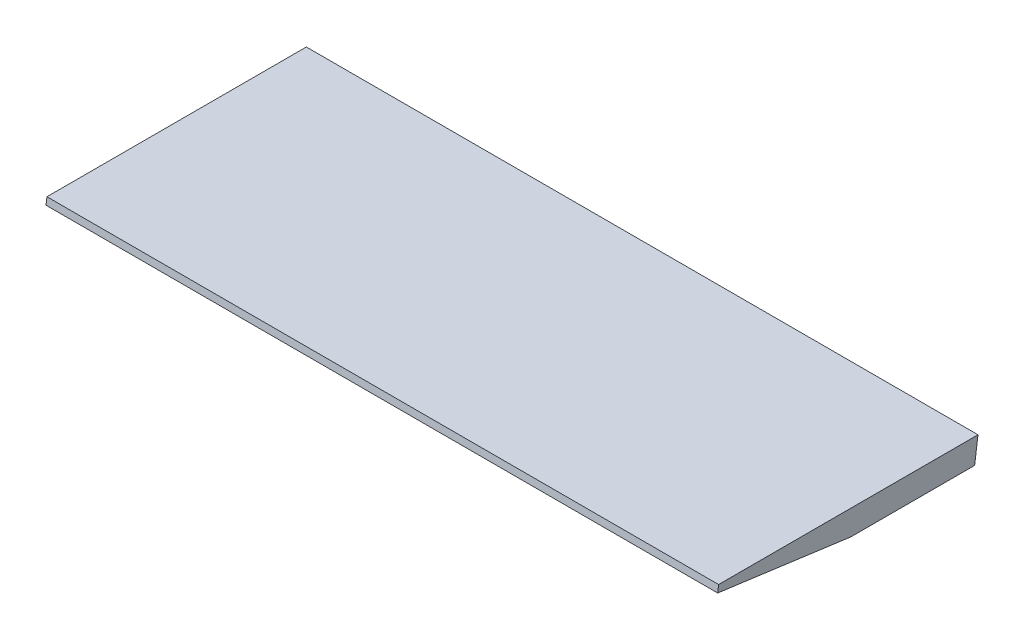
ISO-10303-21;
HEADER;
FILE_DESCRIPTION(('STEP AP214'),'2;1');
FILE_NAME('part.step','',(''),(''),'','','');
FILE_SCHEMA(('AUTOMOTIVE_DESIGN { 1 0 10303 214 1 1 1 1 }'));
ENDSEC;
DATA;
#1=APPLICATION_CONTEXT('core data for automotive mechanical design processes');
#2=APPLICATION_PROTOCOL_DEFINITION('international standard','automotive_design',2000,#1);
#3=PRODUCT_CONTEXT('',#1,'mechanical');
#4=PRODUCT('Part','Part','',(#3));
#5=PRODUCT_RELATED_PRODUCT_CATEGORY('part','',(#4));
#6=PRODUCT_DEFINITION_FORMATION('','',#4);
#7=PRODUCT_DEFINITION_CONTEXT('part definition',#1,'design');
#8=PRODUCT_DEFINITION('design','',#6,#7);
#9=PRODUCT_DEFINITION_SHAPE('','',#8);
#10=(LENGTH_UNIT() NAMED_UNIT(*) SI_UNIT(.MILLI.,.METRE.));
#11=(NAMED_UNIT(*) PLANE_ANGLE_UNIT() SI_UNIT($,.RADIAN.));
#12=(NAMED_UNIT(*) SI_UNIT($,.STERADIAN.) SOLID_ANGLE_UNIT());
#13=UNCERTAINTY_MEASURE_WITH_UNIT(LENGTH_MEASURE(1.E-05),#10,'distance_accuracy_value','');
#14=(GEOMETRIC_REPRESENTATION_CONTEXT(3) GLOBAL_UNCERTAINTY_ASSIGNED_CONTEXT((#13)) GLOBAL_UNIT_ASSIGNED_CONTEXT((#10,
#11,#12)) REPRESENTATION_CONTEXT('',''));
#15=CARTESIAN_POINT('',(0.,0.,0.));
#16=DIRECTION('',(0.,0.,1.));
#17=DIRECTION('',(1.,0.,0.));
#18=AXIS2_PLACEMENT_3D('',#15,#16,#17);
#19=CARTESIAN_POINT('',(0.,19.05,0.));
#20=DIRECTION('',(1.,0.,0.));
#21=DIRECTION('',(0.,0.,-1.));
#22=AXIS2_PLACEMENT_3D('',#19,#20,#21);
#23=PLANE('',#22);
#24=DIRECTION('',(0.,0.133885341623245,0.990996829106142));
#25=VECTOR('',#24,1.);
#26=CARTESIAN_POINT('',(0.,14.3749059096775,0.631613089991631));
#27=LINE('',#26,#25);
#28=CARTESIAN_POINT('',(0.,0.,-105.769027954616));
#29=VERTEX_POINT('',#28);
#30=CARTESIAN_POINT('',(0.,13.7696697688879,-3.84824324910482));
#31=VERTEX_POINT('',#30);
#32=EDGE_CURVE('E59',#29,#31,#27,.T.);
#33=ORIENTED_EDGE('',*,*,#32,.T.);
#34=DIRECTION('',(0.,0.990996829106142,-0.133885341623245));
#35=VECTOR('',#34,1.);
#36=CARTESIAN_POINT('',(0.,18.4447638592103,-4.47985633909645));
#37=LINE('',#36,#35);
#38=CARTESIAN_POINT('',(0.,19.05,-4.56162476165079));
#39=VERTEX_POINT('',#38);
#40=EDGE_CURVE('E105',#31,#39,#37,.T.);
#41=ORIENTED_EDGE('',*,*,#40,.T.);
#42=DIRECTION('',(0.,0.,1.));
#43=VECTOR('',#42,1.);
#44=CARTESIAN_POINT('',(0.,19.05,0.));
#45=LINE('',#44,#43);
#46=CARTESIAN_POINT('',(0.,19.05,-203.2));
#47=VERTEX_POINT('',#46);
#48=EDGE_CURVE('E99',#47,#39,#45,.T.);
#49=ORIENTED_EDGE('',*,*,#48,.F.);
#50=DIRECTION('',(0.,-0.990996829106142,0.133885341623246));
#51=VECTOR('',#50,1.);
#52=CARTESIAN_POINT('',(0.,-7.91056563932562,-199.55758214864));
#53=LINE('',#52,#51);
#54=CARTESIAN_POINT('',(0.,0.,-200.626312897264));
#55=VERTEX_POINT('',#54);
#56=EDGE_CURVE('E120',#47,#55,#53,.T.);
#57=ORIENTED_EDGE('',*,*,#56,.T.);
#58=DIRECTION('',(0.,0.,1.));
#59=VECTOR('',#58,1.);
#60=CARTESIAN_POINT('',(0.,0.,0.));
#61=LINE('',#60,#59);
#62=EDGE_CURVE('E100',#55,#29,#61,.T.);
#63=ORIENTED_EDGE('',*,*,#62,.T.);
#64=EDGE_LOOP('',(#33,#41,#49,#57,#63));
#65=FACE_BOUND('',#64,.T.);
#66=ADVANCED_FACE('F37',(#65),#23,.F.);
#67=CARTESIAN_POINT('',(514.35,19.05,0.));
#68=DIRECTION('',(-1.,0.,0.));
#69=DIRECTION('',(0.,0.,1.));
#70=AXIS2_PLACEMENT_3D('',#67,#68,#69);
#71=PLANE('',#70);
#72=DIRECTION('',(0.,0.,-1.));
#73=VECTOR('',#72,1.);
#74=CARTESIAN_POINT('',(514.35,19.05,0.));
#75=LINE('',#74,#73);
#76=CARTESIAN_POINT('',(514.35,19.05,-4.56162476165079));
#77=VERTEX_POINT('',#76);
#78=CARTESIAN_POINT('',(514.35,19.05,-203.2));
#79=VERTEX_POINT('',#78);
#80=EDGE_CURVE('E103',#77,#79,#75,.T.);
#81=ORIENTED_EDGE('',*,*,#80,.F.);
#82=DIRECTION('',(0.,0.990996829106141,-0.133885341623245));
#83=VECTOR('',#82,1.);
#84=CARTESIAN_POINT('',(514.35,19.05,-4.56162476165079));
#85=LINE('',#84,#83);
#86=CARTESIAN_POINT('',(514.35,13.7696697688879,-3.84824324910482));
#87=VERTEX_POINT('',#86);
#88=EDGE_CURVE('E96',#87,#77,#85,.T.);
#89=ORIENTED_EDGE('',*,*,#88,.F.);
#90=DIRECTION('',(0.,0.133885341623245,0.990996829106142));
#91=VECTOR('',#90,1.);
#92=CARTESIAN_POINT('',(514.35,13.7696697688879,-3.84824324910482));
#93=LINE('',#92,#91);
#94=CARTESIAN_POINT('',(514.35,0.,-105.769027954616));
#95=VERTEX_POINT('',#94);
#96=EDGE_CURVE('E84',#95,#87,#93,.T.);
#97=ORIENTED_EDGE('',*,*,#96,.F.);
#98=DIRECTION('',(0.,0.,-1.));
#99=VECTOR('',#98,1.);
#100=CARTESIAN_POINT('',(514.35,0.,0.));
#101=LINE('',#100,#99);
#102=CARTESIAN_POINT('',(514.35,0.,-200.626312897264));
#103=VERTEX_POINT('',#102);
#104=EDGE_CURVE('E95',#95,#103,#101,.T.);
#105=ORIENTED_EDGE('',*,*,#104,.T.);
#106=DIRECTION('',(0.,-0.990996829106142,0.133885341623246));
#107=VECTOR('',#106,1.);
#108=CARTESIAN_POINT('',(514.35,19.05,-203.2));
#109=LINE('',#108,#107);
#110=EDGE_CURVE('E51',#79,#103,#109,.T.);
#111=ORIENTED_EDGE('',*,*,#110,.F.);
#112=EDGE_LOOP('',(#81,#89,#97,#105,#111));
#113=FACE_BOUND('',#112,.T.);
#114=ADVANCED_FACE('F94',(#113),#71,.F.);
#115=CARTESIAN_POINT('',(0.,19.05,0.));
#116=DIRECTION('',(0.,-1.,0.));
#117=DIRECTION('',(0.,0.,-1.));
#118=AXIS2_PLACEMENT_3D('',#115,#116,#117);
#119=PLANE('',#118);
#120=ORIENTED_EDGE('',*,*,#48,.T.);
#121=DIRECTION('',(1.,0.,0.));
#122=VECTOR('',#121,1.);
#123=CARTESIAN_POINT('',(0.,19.05,-4.56162476165079));
#124=LINE('',#123,#122);
#125=EDGE_CURVE('E11',#39,#77,#124,.T.);
#126=ORIENTED_EDGE('',*,*,#125,.T.);
#127=ORIENTED_EDGE('',*,*,#80,.T.);
#128=DIRECTION('',(-1.,0.,0.));
#129=VECTOR('',#128,1.);
#130=CARTESIAN_POINT('',(0.,19.05,-203.2));
#131=LINE('',#130,#129);
#132=EDGE_CURVE('E109',#79,#47,#131,.T.);
#133=ORIENTED_EDGE('',*,*,#132,.T.);
#134=EDGE_LOOP('',(#120,#126,#127,#133));
#135=FACE_BOUND('',#134,.T.);
#136=ADVANCED_FACE('F127',(#135),#119,.F.);
#137=CARTESIAN_POINT('',(0.,0.,0.));
#138=DIRECTION('',(0.,-1.,0.));
#139=DIRECTION('',(0.,0.,-1.));
#140=AXIS2_PLACEMENT_3D('',#137,#138,#139);
#141=PLANE('',#140);
#142=DIRECTION('',(1.,0.,0.));
#143=VECTOR('',#142,1.);
#144=CARTESIAN_POINT('',(0.,0.,-105.769027954616));
#145=LINE('',#144,#143);
#146=EDGE_CURVE('E44',#29,#95,#145,.T.);
#147=ORIENTED_EDGE('',*,*,#146,.F.);
#148=ORIENTED_EDGE('',*,*,#62,.F.);
#149=DIRECTION('',(-1.,0.,0.));
#150=VECTOR('',#149,1.);
#151=CARTESIAN_POINT('',(0.,0.,-200.626312897264));
#152=LINE('',#151,#150);
#153=EDGE_CURVE('E90',#103,#55,#152,.T.);
#154=ORIENTED_EDGE('',*,*,#153,.F.);
#155=ORIENTED_EDGE('',*,*,#104,.F.);
#156=EDGE_LOOP('',(#147,#148,#154,#155));
#157=FACE_BOUND('',#156,.T.);
#158=ADVANCED_FACE('F98',(#157),#141,.T.);
#159=CARTESIAN_POINT('',(-267.336405158948,19.05,-203.2));
#160=DIRECTION('',(0.,0.133885341623246,0.990996829106141));
#161=DIRECTION('',(0.,-0.990996829106141,0.133885341623246));
#162=AXIS2_PLACEMENT_3D('',#159,#160,#161);
#163=PLANE('',#162);
#164=ORIENTED_EDGE('',*,*,#132,.F.);
#165=ORIENTED_EDGE('',*,*,#110,.T.);
#166=ORIENTED_EDGE('',*,*,#153,.T.);
#167=ORIENTED_EDGE('',*,*,#56,.F.);
#168=EDGE_LOOP('',(#164,#165,#166,#167));
#169=FACE_BOUND('',#168,.T.);
#170=ADVANCED_FACE('F129',(#169),#163,.F.);
#171=CARTESIAN_POINT('',(-267.336405158948,19.05,-4.56162476165079));
#172=DIRECTION('',(0.,-0.133885341623245,-0.990996829106141));
#173=DIRECTION('',(0.,0.990996829106142,-0.133885341623245));
#174=AXIS2_PLACEMENT_3D('',#171,#172,#173);
#175=PLANE('',#174);
#176=DIRECTION('',(1.,0.,0.));
#177=VECTOR('',#176,1.);
#178=CARTESIAN_POINT('',(-267.336405158948,13.7696697688879,-3.84824324910482));
#179=LINE('',#178,#177);
#180=EDGE_CURVE('E122',#31,#87,#179,.T.);
#181=ORIENTED_EDGE('',*,*,#180,.T.);
#182=ORIENTED_EDGE('',*,*,#88,.T.);
#183=ORIENTED_EDGE('',*,*,#125,.F.);
#184=ORIENTED_EDGE('',*,*,#40,.F.);
#185=EDGE_LOOP('',(#181,#182,#183,#184));
#186=FACE_BOUND('',#185,.T.);
#187=ADVANCED_FACE('F126',(#186),#175,.F.);
#188=CARTESIAN_POINT('',(-267.336405158948,13.7696697688879,-3.84824324910482));
#189=DIRECTION('',(0.,0.990996829106141,-0.133885341623245));
#190=DIRECTION('',(0.,0.133885341623245,0.990996829106141));
#191=AXIS2_PLACEMENT_3D('',#188,#189,#190);
#192=PLANE('',#191);
#193=ORIENTED_EDGE('',*,*,#146,.T.);
#194=ORIENTED_EDGE('',*,*,#96,.T.);
#195=ORIENTED_EDGE('',*,*,#180,.F.);
#196=ORIENTED_EDGE('',*,*,#32,.F.);
#197=EDGE_LOOP('',(#193,#194,#195,#196));
#198=FACE_BOUND('',#197,.T.);
#199=ADVANCED_FACE('F83',(#198),#192,.F.);
#200=CLOSED_SHELL('',(#66,#114,#136,#158,#170,#187,#199));
#201=MANIFOLD_SOLID_BREP('B2',#200);
#202=ADVANCED_BREP_SHAPE_REPRESENTATION('',(#18,#201),#14);
#203=SHAPE_DEFINITION_REPRESENTATION(#9,#202);
ENDSEC;
END-ISO-10303-21;
